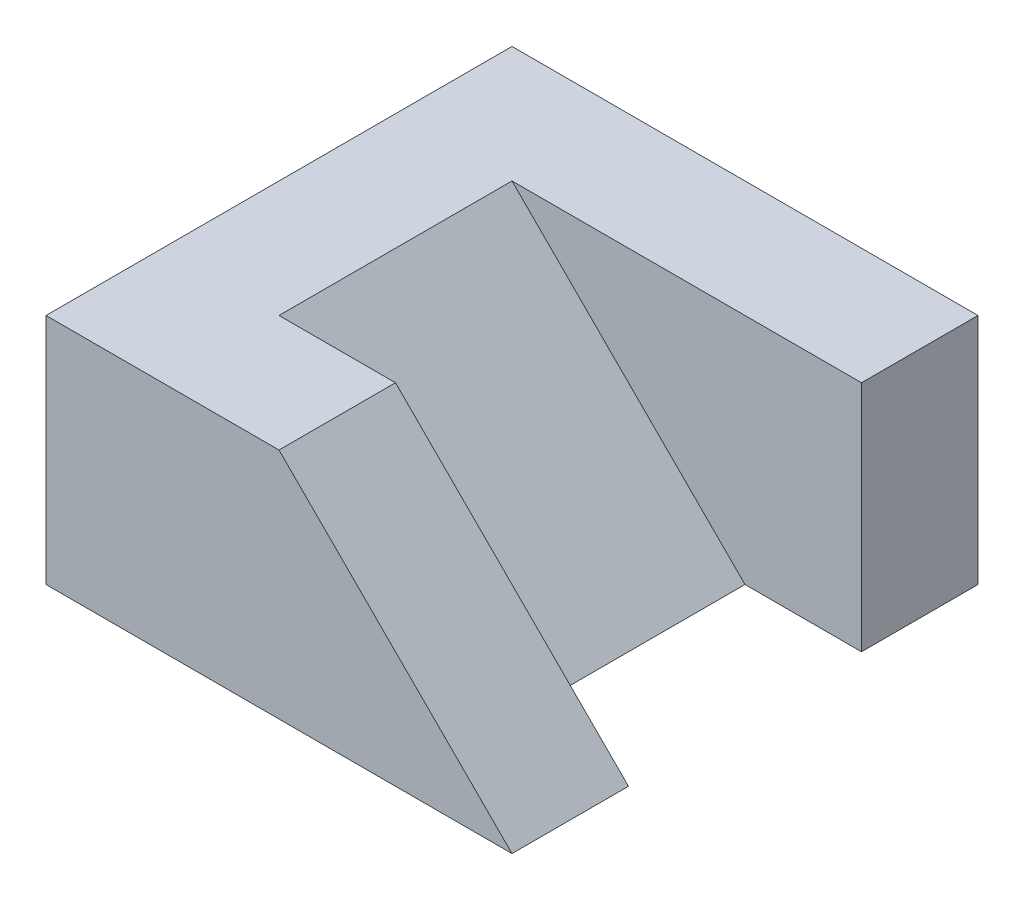
ISO-10303-21;
HEADER;
FILE_DESCRIPTION(('STEP AP214'),'2;1');
FILE_NAME('part.step','',(''),(''),'','','');
FILE_SCHEMA(('AUTOMOTIVE_DESIGN { 1 0 10303 214 1 1 1 1 }'));
ENDSEC;
DATA;
#1=APPLICATION_CONTEXT('core data for automotive mechanical design processes');
#2=APPLICATION_PROTOCOL_DEFINITION('international standard','automotive_design',2000,#1);
#3=PRODUCT_CONTEXT('',#1,'mechanical');
#4=PRODUCT('Part','Part','',(#3));
#5=PRODUCT_RELATED_PRODUCT_CATEGORY('part','',(#4));
#6=PRODUCT_DEFINITION_FORMATION('','',#4);
#7=PRODUCT_DEFINITION_CONTEXT('part definition',#1,'design');
#8=PRODUCT_DEFINITION('design','',#6,#7);
#9=PRODUCT_DEFINITION_SHAPE('','',#8);
#10=(LENGTH_UNIT() NAMED_UNIT(*) SI_UNIT(.MILLI.,.METRE.));
#11=(NAMED_UNIT(*) PLANE_ANGLE_UNIT() SI_UNIT($,.RADIAN.));
#12=(NAMED_UNIT(*) SI_UNIT($,.STERADIAN.) SOLID_ANGLE_UNIT());
#13=UNCERTAINTY_MEASURE_WITH_UNIT(LENGTH_MEASURE(1.E-05),#10,'distance_accuracy_value','');
#14=(GEOMETRIC_REPRESENTATION_CONTEXT(3) GLOBAL_UNCERTAINTY_ASSIGNED_CONTEXT((#13)) GLOBAL_UNIT_ASSIGNED_CONTEXT((#10,
#11,#12)) REPRESENTATION_CONTEXT('',''));
#15=CARTESIAN_POINT('',(0.,0.,0.));
#16=DIRECTION('',(0.,0.,1.));
#17=DIRECTION('',(1.,0.,0.));
#18=AXIS2_PLACEMENT_3D('',#15,#16,#17);
#19=CARTESIAN_POINT('',(-19.7560975609756,20.,-6.58536585365853));
#20=DIRECTION('',(0.,0.,-1.));
#21=DIRECTION('',(-1.,0.,0.));
#22=AXIS2_PLACEMENT_3D('',#19,#20,#21);
#23=PLANE('',#22);
#24=DIRECTION('',(1.,0.,0.));
#25=VECTOR('',#24,1.);
#26=CARTESIAN_POINT('',(-19.7560975609756,0.,-6.58536585365853));
#27=LINE('',#26,#25);
#28=CARTESIAN_POINT('',(-19.7560975609756,0.,-6.58536585365853));
#29=VERTEX_POINT('',#28);
#30=CARTESIAN_POINT('',(-9.75609756097562,0.,-6.58536585365853));
#31=VERTEX_POINT('',#30);
#32=EDGE_CURVE('E157',#29,#31,#27,.T.);
#33=ORIENTED_EDGE('',*,*,#32,.T.);
#34=DIRECTION('',(0.,-1.,0.));
#35=VECTOR('',#34,1.);
#36=CARTESIAN_POINT('',(-9.75609756097562,20.,-6.58536585365853));
#37=LINE('',#36,#35);
#38=CARTESIAN_POINT('',(-9.75609756097562,20.,-6.58536585365853));
#39=VERTEX_POINT('',#38);
#40=EDGE_CURVE('E11',#39,#31,#37,.T.);
#41=ORIENTED_EDGE('',*,*,#40,.F.);
#42=DIRECTION('',(1.,0.,0.));
#43=VECTOR('',#42,1.);
#44=CARTESIAN_POINT('',(-19.7560975609756,20.,-6.58536585365853));
#45=LINE('',#44,#43);
#46=CARTESIAN_POINT('',(-39.7560975609756,20.,-6.58536585365853));
#47=VERTEX_POINT('',#46);
#48=EDGE_CURVE('E158',#47,#39,#45,.T.);
#49=ORIENTED_EDGE('',*,*,#48,.F.);
#50=DIRECTION('',(0.707106781186548,-0.707106781186547,0.));
#51=VECTOR('',#50,1.);
#52=CARTESIAN_POINT('',(-19.7560975609756,0.,-6.58536585365853));
#53=LINE('',#52,#51);
#54=EDGE_CURVE('E145',#47,#29,#53,.T.);
#55=ORIENTED_EDGE('',*,*,#54,.T.);
#56=EDGE_LOOP('',(#33,#41,#49,#55));
#57=FACE_BOUND('',#56,.T.);
#58=ADVANCED_FACE('F39',(#57),#23,.F.);
#59=CARTESIAN_POINT('',(-9.75609756097562,20.,-6.58536585365853));
#60=DIRECTION('',(-1.,0.,0.));
#61=DIRECTION('',(0.,0.,1.));
#62=AXIS2_PLACEMENT_3D('',#59,#60,#61);
#63=PLANE('',#62);
#64=DIRECTION('',(0.,0.,-1.));
#65=VECTOR('',#64,1.);
#66=CARTESIAN_POINT('',(-9.75609756097562,0.,-6.58536585365853));
#67=LINE('',#66,#65);
#68=CARTESIAN_POINT('',(-9.75609756097562,0.,-16.5853658536585));
#69=VERTEX_POINT('',#68);
#70=EDGE_CURVE('E173',#31,#69,#67,.T.);
#71=ORIENTED_EDGE('',*,*,#70,.T.);
#72=DIRECTION('',(0.,-1.,0.));
#73=VECTOR('',#72,1.);
#74=CARTESIAN_POINT('',(-9.75609756097562,20.,-16.5853658536585));
#75=LINE('',#74,#73);
#76=CARTESIAN_POINT('',(-9.75609756097562,20.,-16.5853658536585));
#77=VERTEX_POINT('',#76);
#78=EDGE_CURVE('E48',#77,#69,#75,.T.);
#79=ORIENTED_EDGE('',*,*,#78,.F.);
#80=DIRECTION('',(0.,0.,-1.));
#81=VECTOR('',#80,1.);
#82=CARTESIAN_POINT('',(-9.75609756097562,20.,-6.58536585365853));
#83=LINE('',#82,#81);
#84=EDGE_CURVE('E85',#39,#77,#83,.T.);
#85=ORIENTED_EDGE('',*,*,#84,.F.);
#86=ORIENTED_EDGE('',*,*,#40,.T.);
#87=EDGE_LOOP('',(#71,#79,#85,#86));
#88=FACE_BOUND('',#87,.T.);
#89=ADVANCED_FACE('F208',(#88),#63,.F.);
#90=CARTESIAN_POINT('',(-9.75609756097562,20.,-16.5853658536585));
#91=DIRECTION('',(0.,0.,1.));
#92=DIRECTION('',(1.,0.,0.));
#93=AXIS2_PLACEMENT_3D('',#90,#91,#92);
#94=PLANE('',#93);
#95=DIRECTION('',(-1.,0.,0.));
#96=VECTOR('',#95,1.);
#97=CARTESIAN_POINT('',(-9.75609756097562,0.,-16.5853658536585));
#98=LINE('',#97,#96);
#99=CARTESIAN_POINT('',(-49.7560975609756,0.,-16.5853658536585));
#100=VERTEX_POINT('',#99);
#101=EDGE_CURVE('E73',#69,#100,#98,.T.);
#102=ORIENTED_EDGE('',*,*,#101,.T.);
#103=DIRECTION('',(0.,-1.,0.));
#104=VECTOR('',#103,1.);
#105=CARTESIAN_POINT('',(-49.7560975609756,20.,-16.5853658536585));
#106=LINE('',#105,#104);
#107=CARTESIAN_POINT('',(-49.7560975609756,20.,-16.5853658536585));
#108=VERTEX_POINT('',#107);
#109=EDGE_CURVE('E169',#108,#100,#106,.T.);
#110=ORIENTED_EDGE('',*,*,#109,.F.);
#111=DIRECTION('',(-1.,0.,0.));
#112=VECTOR('',#111,1.);
#113=CARTESIAN_POINT('',(-9.75609756097562,20.,-16.5853658536585));
#114=LINE('',#113,#112);
#115=EDGE_CURVE('E56',#77,#108,#114,.T.);
#116=ORIENTED_EDGE('',*,*,#115,.F.);
#117=ORIENTED_EDGE('',*,*,#78,.T.);
#118=EDGE_LOOP('',(#102,#110,#116,#117));
#119=FACE_BOUND('',#118,.T.);
#120=ADVANCED_FACE('F185',(#119),#94,.F.);
#121=CARTESIAN_POINT('',(-49.7560975609756,20.,-16.5853658536585));
#122=DIRECTION('',(1.,0.,0.));
#123=DIRECTION('',(0.,0.,-1.));
#124=AXIS2_PLACEMENT_3D('',#121,#122,#123);
#125=PLANE('',#124);
#126=DIRECTION('',(0.,0.,1.));
#127=VECTOR('',#126,1.);
#128=CARTESIAN_POINT('',(-49.7560975609756,0.,-16.5853658536585));
#129=LINE('',#128,#127);
#130=CARTESIAN_POINT('',(-49.7560975609756,0.,23.4146341463415));
#131=VERTEX_POINT('',#130);
#132=EDGE_CURVE('E178',#100,#131,#129,.T.);
#133=ORIENTED_EDGE('',*,*,#132,.T.);
#134=DIRECTION('',(0.,-1.,0.));
#135=VECTOR('',#134,1.);
#136=CARTESIAN_POINT('',(-49.7560975609756,20.,23.4146341463415));
#137=LINE('',#136,#135);
#138=CARTESIAN_POINT('',(-49.7560975609756,20.,23.4146341463415));
#139=VERTEX_POINT('',#138);
#140=EDGE_CURVE('E131',#139,#131,#137,.T.);
#141=ORIENTED_EDGE('',*,*,#140,.F.);
#142=DIRECTION('',(0.,0.,1.));
#143=VECTOR('',#142,1.);
#144=CARTESIAN_POINT('',(-49.7560975609756,20.,-16.5853658536585));
#145=LINE('',#144,#143);
#146=EDGE_CURVE('E166',#108,#139,#145,.T.);
#147=ORIENTED_EDGE('',*,*,#146,.F.);
#148=ORIENTED_EDGE('',*,*,#109,.T.);
#149=EDGE_LOOP('',(#133,#141,#147,#148));
#150=FACE_BOUND('',#149,.T.);
#151=ADVANCED_FACE('F187',(#150),#125,.F.);
#152=CARTESIAN_POINT('',(0.,20.,0.));
#153=DIRECTION('',(0.,1.,0.));
#154=DIRECTION('',(0.,0.,1.));
#155=AXIS2_PLACEMENT_3D('',#152,#153,#154);
#156=PLANE('',#155);
#157=DIRECTION('',(0.,0.,1.));
#158=VECTOR('',#157,1.);
#159=CARTESIAN_POINT('',(-39.7560975609756,20.,-6.58536585365853));
#160=LINE('',#159,#158);
#161=CARTESIAN_POINT('',(-39.7560975609756,20.,13.4146341463415));
#162=VERTEX_POINT('',#161);
#163=EDGE_CURVE('E152',#47,#162,#160,.T.);
#164=ORIENTED_EDGE('',*,*,#163,.F.);
#165=ORIENTED_EDGE('',*,*,#48,.T.);
#166=ORIENTED_EDGE('',*,*,#84,.T.);
#167=ORIENTED_EDGE('',*,*,#115,.T.);
#168=ORIENTED_EDGE('',*,*,#146,.T.);
#169=DIRECTION('',(-1.,0.,0.));
#170=VECTOR('',#169,1.);
#171=CARTESIAN_POINT('',(-29.7560975609758,20.,23.4146341463415));
#172=LINE('',#171,#170);
#173=CARTESIAN_POINT('',(-29.7560975609758,20.,23.4146341463415));
#174=VERTEX_POINT('',#173);
#175=EDGE_CURVE('E124',#174,#139,#172,.T.);
#176=ORIENTED_EDGE('',*,*,#175,.F.);
#177=DIRECTION('',(0.,0.,-1.));
#178=VECTOR('',#177,1.);
#179=CARTESIAN_POINT('',(-29.7560975609758,20.,23.4146341463415));
#180=LINE('',#179,#178);
#181=CARTESIAN_POINT('',(-29.7560975609758,20.,13.4146341463415));
#182=VERTEX_POINT('',#181);
#183=EDGE_CURVE('E119',#174,#182,#180,.T.);
#184=ORIENTED_EDGE('',*,*,#183,.T.);
#185=DIRECTION('',(-1.,0.,0.));
#186=VECTOR('',#185,1.);
#187=CARTESIAN_POINT('',(-29.7560975609758,20.,13.4146341463415));
#188=LINE('',#187,#186);
#189=EDGE_CURVE('E135',#182,#162,#188,.T.);
#190=ORIENTED_EDGE('',*,*,#189,.T.);
#191=EDGE_LOOP('',(#164,#165,#166,#167,#168,#176,#184,#190));
#192=FACE_BOUND('',#191,.T.);
#193=ADVANCED_FACE('F190',(#192),#156,.T.);
#194=CARTESIAN_POINT('',(0.,0.,0.));
#195=DIRECTION('',(0.,1.,0.));
#196=DIRECTION('',(0.,0.,1.));
#197=AXIS2_PLACEMENT_3D('',#194,#195,#196);
#198=PLANE('',#197);
#199=ORIENTED_EDGE('',*,*,#32,.F.);
#200=DIRECTION('',(0.,0.,-1.));
#201=VECTOR('',#200,1.);
#202=CARTESIAN_POINT('',(-19.7560975609756,0.,-6.58536585365853));
#203=LINE('',#202,#201);
#204=CARTESIAN_POINT('',(-19.7560975609756,0.,13.4146341463415));
#205=VERTEX_POINT('',#204);
#206=EDGE_CURVE('E161',#205,#29,#203,.T.);
#207=ORIENTED_EDGE('',*,*,#206,.F.);
#208=DIRECTION('',(1.,0.,0.));
#209=VECTOR('',#208,1.);
#210=CARTESIAN_POINT('',(-49.7560975609756,0.,13.4146341463415));
#211=LINE('',#210,#209);
#212=CARTESIAN_POINT('',(-9.75609756097562,0.,13.4146341463415));
#213=VERTEX_POINT('',#212);
#214=EDGE_CURVE('E80',#205,#213,#211,.T.);
#215=ORIENTED_EDGE('',*,*,#214,.T.);
#216=DIRECTION('',(0.,0.,-1.));
#217=VECTOR('',#216,1.);
#218=CARTESIAN_POINT('',(-9.75609756097562,0.,23.4146341463415));
#219=LINE('',#218,#217);
#220=CARTESIAN_POINT('',(-9.75609756097562,0.,23.4146341463415));
#221=VERTEX_POINT('',#220);
#222=EDGE_CURVE('E117',#221,#213,#219,.T.);
#223=ORIENTED_EDGE('',*,*,#222,.F.);
#224=DIRECTION('',(1.,0.,0.));
#225=VECTOR('',#224,1.);
#226=CARTESIAN_POINT('',(-49.7560975609756,0.,23.4146341463415));
#227=LINE('',#226,#225);
#228=EDGE_CURVE('E125',#131,#221,#227,.T.);
#229=ORIENTED_EDGE('',*,*,#228,.F.);
#230=ORIENTED_EDGE('',*,*,#132,.F.);
#231=ORIENTED_EDGE('',*,*,#101,.F.);
#232=ORIENTED_EDGE('',*,*,#70,.F.);
#233=EDGE_LOOP('',(#199,#207,#215,#223,#229,#230,#231,#232));
#234=FACE_BOUND('',#233,.T.);
#235=ADVANCED_FACE('F138',(#234),#198,.F.);
#236=CARTESIAN_POINT('',(-19.7560975609756,0.,-6.58536585365853));
#237=DIRECTION('',(-0.707106781186547,-0.707106781186548,0.));
#238=DIRECTION('',(0.707106781186548,-0.707106781186547,0.));
#239=AXIS2_PLACEMENT_3D('',#236,#237,#238);
#240=PLANE('',#239);
#241=DIRECTION('',(0.707106781186548,-0.707106781186547,0.));
#242=VECTOR('',#241,1.);
#243=CARTESIAN_POINT('',(-19.7560975609756,0.,13.4146341463415));
#244=LINE('',#243,#242);
#245=EDGE_CURVE('E141',#162,#205,#244,.T.);
#246=ORIENTED_EDGE('',*,*,#245,.T.);
#247=ORIENTED_EDGE('',*,*,#206,.T.);
#248=ORIENTED_EDGE('',*,*,#54,.F.);
#249=ORIENTED_EDGE('',*,*,#163,.T.);
#250=EDGE_LOOP('',(#246,#247,#248,#249));
#251=FACE_BOUND('',#250,.T.);
#252=ADVANCED_FACE('F205',(#251),#240,.F.);
#253=CARTESIAN_POINT('',(0.,0.,13.4146341463415));
#254=DIRECTION('',(0.,0.,-1.));
#255=DIRECTION('',(-1.,0.,0.));
#256=AXIS2_PLACEMENT_3D('',#253,#254,#255);
#257=PLANE('',#256);
#258=ORIENTED_EDGE('',*,*,#245,.F.);
#259=ORIENTED_EDGE('',*,*,#189,.F.);
#260=DIRECTION('',(-0.707106781186551,0.707106781186544,0.));
#261=VECTOR('',#260,1.);
#262=CARTESIAN_POINT('',(-9.75609756097562,0.,13.4146341463415));
#263=LINE('',#262,#261);
#264=EDGE_CURVE('E198',#213,#182,#263,.T.);
#265=ORIENTED_EDGE('',*,*,#264,.F.);
#266=ORIENTED_EDGE('',*,*,#214,.F.);
#267=EDGE_LOOP('',(#258,#259,#265,#266));
#268=FACE_BOUND('',#267,.T.);
#269=ADVANCED_FACE('F224',(#268),#257,.T.);
#270=CARTESIAN_POINT('',(-9.75609756097562,0.,23.4146341463415));
#271=DIRECTION('',(-0.707106781186544,-0.707106781186551,0.));
#272=DIRECTION('',(0.707106781186551,-0.707106781186544,0.));
#273=AXIS2_PLACEMENT_3D('',#270,#271,#272);
#274=PLANE('',#273);
#275=ORIENTED_EDGE('',*,*,#264,.T.);
#276=ORIENTED_EDGE('',*,*,#183,.F.);
#277=DIRECTION('',(-0.707106781186551,0.707106781186544,0.));
#278=VECTOR('',#277,1.);
#279=CARTESIAN_POINT('',(-9.75609756097562,0.,23.4146341463415));
#280=LINE('',#279,#278);
#281=EDGE_CURVE('E113',#221,#174,#280,.T.);
#282=ORIENTED_EDGE('',*,*,#281,.F.);
#283=ORIENTED_EDGE('',*,*,#222,.T.);
#284=EDGE_LOOP('',(#275,#276,#282,#283));
#285=FACE_BOUND('',#284,.T.);
#286=ADVANCED_FACE('F115',(#285),#274,.F.);
#287=CARTESIAN_POINT('',(0.,0.,23.4146341463415));
#288=DIRECTION('',(0.,0.,-1.));
#289=DIRECTION('',(-1.,0.,0.));
#290=AXIS2_PLACEMENT_3D('',#287,#288,#289);
#291=PLANE('',#290);
#292=ORIENTED_EDGE('',*,*,#228,.T.);
#293=ORIENTED_EDGE('',*,*,#281,.T.);
#294=ORIENTED_EDGE('',*,*,#175,.T.);
#295=ORIENTED_EDGE('',*,*,#140,.T.);
#296=EDGE_LOOP('',(#292,#293,#294,#295));
#297=FACE_BOUND('',#296,.T.);
#298=ADVANCED_FACE('F129',(#297),#291,.F.);
#299=CLOSED_SHELL('',(#58,#89,#120,#151,#193,#235,#252,#269,#286,#298));
#300=MANIFOLD_SOLID_BREP('B2',#299);
#301=ADVANCED_BREP_SHAPE_REPRESENTATION('',(#18,#300),#14);
#302=SHAPE_DEFINITION_REPRESENTATION(#9,#301);
ENDSEC;
END-ISO-10303-21;
